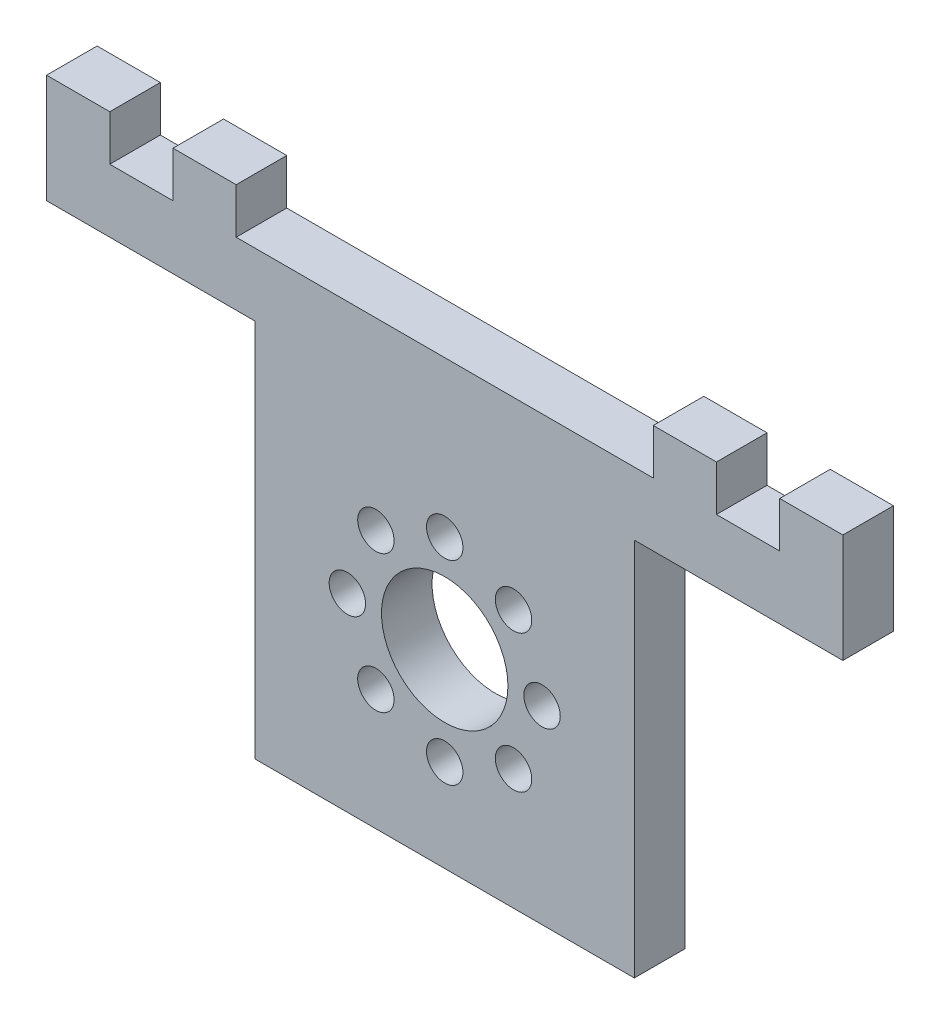
ISO-10303-21;
HEADER;
FILE_DESCRIPTION(('STEP AP214'),'2;1');
FILE_NAME('part.step','',(''),(''),'','','');
FILE_SCHEMA(('AUTOMOTIVE_DESIGN { 1 0 10303 214 1 1 1 1 }'));
ENDSEC;
DATA;
#1=APPLICATION_CONTEXT('core data for automotive mechanical design processes');
#2=APPLICATION_PROTOCOL_DEFINITION('international standard','automotive_design',2000,#1);
#3=PRODUCT_CONTEXT('',#1,'mechanical');
#4=PRODUCT('Part','Part','',(#3));
#5=PRODUCT_RELATED_PRODUCT_CATEGORY('part','',(#4));
#6=PRODUCT_DEFINITION_FORMATION('','',#4);
#7=PRODUCT_DEFINITION_CONTEXT('part definition',#1,'design');
#8=PRODUCT_DEFINITION('design','',#6,#7);
#9=PRODUCT_DEFINITION_SHAPE('','',#8);
#10=(LENGTH_UNIT() NAMED_UNIT(*) SI_UNIT(.MILLI.,.METRE.));
#11=(NAMED_UNIT(*) PLANE_ANGLE_UNIT() SI_UNIT($,.RADIAN.));
#12=(NAMED_UNIT(*) SI_UNIT($,.STERADIAN.) SOLID_ANGLE_UNIT());
#13=UNCERTAINTY_MEASURE_WITH_UNIT(LENGTH_MEASURE(1.E-05),#10,'distance_accuracy_value','');
#14=(GEOMETRIC_REPRESENTATION_CONTEXT(3) GLOBAL_UNCERTAINTY_ASSIGNED_CONTEXT((#13)) GLOBAL_UNIT_ASSIGNED_CONTEXT((#10,
#11,#12)) REPRESENTATION_CONTEXT('',''));
#15=CARTESIAN_POINT('',(0.,0.,0.));
#16=DIRECTION('',(0.,0.,1.));
#17=DIRECTION('',(1.,0.,0.));
#18=AXIS2_PLACEMENT_3D('',#15,#16,#17);
#19=CARTESIAN_POINT('',(57.08030875,7.59023437500003,5.08));
#20=DIRECTION('',(0.,-1.,0.));
#21=DIRECTION('',(1.,0.,0.));
#22=AXIS2_PLACEMENT_3D('',#19,#20,#21);
#23=PLANE('',#22);
#24=DIRECTION('',(-1.,0.,0.));
#25=VECTOR('',#24,1.);
#26=CARTESIAN_POINT('',(57.08030875,7.59023437500003,5.08));
#27=LINE('',#26,#25);
#28=CARTESIAN_POINT('',(50.73030875,7.59023437500002,5.08));
#29=VERTEX_POINT('',#28);
#30=CARTESIAN_POINT('',(44.38030875,7.59023437500002,5.08));
#31=VERTEX_POINT('',#30);
#32=EDGE_CURVE('E48',#29,#31,#27,.T.);
#33=ORIENTED_EDGE('',*,*,#32,.F.);
#34=DIRECTION('',(0.,0.,-1.));
#35=VECTOR('',#34,1.);
#36=CARTESIAN_POINT('',(50.73030875,7.59023437500002,5.08));
#37=LINE('',#36,#35);
#38=CARTESIAN_POINT('',(50.73030875,7.59023437500002,0.));
#39=VERTEX_POINT('',#38);
#40=EDGE_CURVE('E184',#29,#39,#37,.T.);
#41=ORIENTED_EDGE('',*,*,#40,.T.);
#42=DIRECTION('',(-1.,0.,0.));
#43=VECTOR('',#42,1.);
#44=CARTESIAN_POINT('',(57.08030875,7.59023437500003,0.));
#45=LINE('',#44,#43);
#46=CARTESIAN_POINT('',(44.38030875,7.59023437500002,0.));
#47=VERTEX_POINT('',#46);
#48=EDGE_CURVE('E300',#39,#47,#45,.T.);
#49=ORIENTED_EDGE('',*,*,#48,.T.);
#50=DIRECTION('',(0.,0.,-1.));
#51=VECTOR('',#50,1.);
#52=CARTESIAN_POINT('',(44.38030875,7.59023437500003,5.08));
#53=LINE('',#52,#51);
#54=EDGE_CURVE('E227',#31,#47,#53,.T.);
#55=ORIENTED_EDGE('',*,*,#54,.F.);
#56=EDGE_LOOP('',(#33,#41,#49,#55));
#57=FACE_BOUND('',#56,.T.);
#58=ADVANCED_FACE('F33',(#57),#23,.F.);
#59=CARTESIAN_POINT('',(-10.21953125,7.590234375,5.08));
#60=VERTEX_POINT('',#59);
#61=CARTESIAN_POINT('',(-16.56953125,7.590234375,5.08));
#62=VERTEX_POINT('',#61);
#63=EDGE_CURVE('E286',#60,#62,#27,.T.);
#64=ORIENTED_EDGE('',*,*,#63,.F.);
#65=DIRECTION('',(0.,0.,-1.));
#66=VECTOR('',#65,1.);
#67=CARTESIAN_POINT('',(-10.21953125,7.59023437500003,5.08));
#68=LINE('',#67,#66);
#69=CARTESIAN_POINT('',(-10.21953125,7.59023437500003,0.));
#70=VERTEX_POINT('',#69);
#71=EDGE_CURVE('E254',#60,#70,#68,.T.);
#72=ORIENTED_EDGE('',*,*,#71,.T.);
#73=CARTESIAN_POINT('',(-16.56953125,7.59023437500002,0.));
#74=VERTEX_POINT('',#73);
#75=EDGE_CURVE('E279',#70,#74,#45,.T.);
#76=ORIENTED_EDGE('',*,*,#75,.T.);
#77=DIRECTION('',(0.,0.,-1.));
#78=VECTOR('',#77,1.);
#79=CARTESIAN_POINT('',(-16.56953125,7.59023437500002,5.08));
#80=LINE('',#79,#78);
#81=EDGE_CURVE('E276',#62,#74,#80,.T.);
#82=ORIENTED_EDGE('',*,*,#81,.F.);
#83=EDGE_LOOP('',(#64,#72,#76,#82));
#84=FACE_BOUND('',#83,.T.);
#85=ADVANCED_FACE('F367',(#84),#23,.F.);
#86=CARTESIAN_POINT('',(38.03030875,7.59023437500002,5.08));
#87=VERTEX_POINT('',#86);
#88=CARTESIAN_POINT('',(-3.86953125,7.59023437500001,5.08));
#89=VERTEX_POINT('',#88);
#90=EDGE_CURVE('E56',#87,#89,#27,.T.);
#91=ORIENTED_EDGE('',*,*,#90,.F.);
#92=DIRECTION('',(0.,0.,-1.));
#93=VECTOR('',#92,1.);
#94=CARTESIAN_POINT('',(38.03030875,7.59023437500002,5.08));
#95=LINE('',#94,#93);
#96=CARTESIAN_POINT('',(38.03030875,7.59023437500002,0.));
#97=VERTEX_POINT('',#96);
#98=EDGE_CURVE('E219',#87,#97,#95,.T.);
#99=ORIENTED_EDGE('',*,*,#98,.T.);
#100=CARTESIAN_POINT('',(-3.86953125,7.59023437500001,0.));
#101=VERTEX_POINT('',#100);
#102=EDGE_CURVE('E303',#97,#101,#45,.T.);
#103=ORIENTED_EDGE('',*,*,#102,.T.);
#104=DIRECTION('',(0.,0.,-1.));
#105=VECTOR('',#104,1.);
#106=CARTESIAN_POINT('',(-3.86953125,7.59023437500002,5.08));
#107=LINE('',#106,#105);
#108=EDGE_CURVE('E258',#89,#101,#107,.T.);
#109=ORIENTED_EDGE('',*,*,#108,.F.);
#110=EDGE_LOOP('',(#91,#99,#103,#109));
#111=FACE_BOUND('',#110,.T.);
#112=ADVANCED_FACE('F35',(#111),#23,.F.);
#113=CARTESIAN_POINT('',(-22.91953125,7.590234375,5.08));
#114=DIRECTION('',(1.,0.,0.));
#115=DIRECTION('',(0.,0.,-1.));
#116=AXIS2_PLACEMENT_3D('',#113,#114,#115);
#117=PLANE('',#116);
#118=DIRECTION('',(0.,-1.,0.));
#119=VECTOR('',#118,1.);
#120=CARTESIAN_POINT('',(-22.91953125,7.590234375,0.));
#121=LINE('',#120,#119);
#122=CARTESIAN_POINT('',(-22.91953125,12.162234375,0.));
#123=VERTEX_POINT('',#122);
#124=CARTESIAN_POINT('',(-22.91953125,1.240234375,0.));
#125=VERTEX_POINT('',#124);
#126=EDGE_CURVE('E302',#123,#125,#121,.T.);
#127=ORIENTED_EDGE('',*,*,#126,.T.);
#128=DIRECTION('',(0.,0.,-1.));
#129=VECTOR('',#128,1.);
#130=CARTESIAN_POINT('',(-22.91953125,1.240234375,5.08));
#131=LINE('',#130,#129);
#132=CARTESIAN_POINT('',(-22.91953125,1.240234375,5.08));
#133=VERTEX_POINT('',#132);
#134=EDGE_CURVE('E11',#133,#125,#131,.T.);
#135=ORIENTED_EDGE('',*,*,#134,.F.);
#136=DIRECTION('',(0.,-1.,0.));
#137=VECTOR('',#136,1.);
#138=CARTESIAN_POINT('',(-22.91953125,7.590234375,5.08));
#139=LINE('',#138,#137);
#140=CARTESIAN_POINT('',(-22.91953125,12.162234375,5.08));
#141=VERTEX_POINT('',#140);
#142=EDGE_CURVE('E285',#141,#133,#139,.T.);
#143=ORIENTED_EDGE('',*,*,#142,.F.);
#144=DIRECTION('',(0.,0.,-1.));
#145=VECTOR('',#144,1.);
#146=CARTESIAN_POINT('',(-22.91953125,12.162234375,5.08));
#147=LINE('',#146,#145);
#148=EDGE_CURVE('E271',#141,#123,#147,.T.);
#149=ORIENTED_EDGE('',*,*,#148,.T.);
#150=EDGE_LOOP('',(#127,#135,#143,#149));
#151=FACE_BOUND('',#150,.T.);
#152=ADVANCED_FACE('F356',(#151),#117,.F.);
#153=CARTESIAN_POINT('',(-22.91953125,1.240234375,5.08));
#154=DIRECTION('',(0.,1.,0.));
#155=DIRECTION('',(-1.,0.,0.));
#156=AXIS2_PLACEMENT_3D('',#153,#154,#155);
#157=PLANE('',#156);
#158=DIRECTION('',(1.,0.,0.));
#159=VECTOR('',#158,1.);
#160=CARTESIAN_POINT('',(-22.91953125,1.240234375,0.));
#161=LINE('',#160,#159);
#162=CARTESIAN_POINT('',(-1.96961125,1.240234375,0.));
#163=VERTEX_POINT('',#162);
#164=EDGE_CURVE('E305',#125,#163,#161,.T.);
#165=ORIENTED_EDGE('',*,*,#164,.T.);
#166=DIRECTION('',(0.,0.,-1.));
#167=VECTOR('',#166,1.);
#168=CARTESIAN_POINT('',(-1.96961125,1.240234375,5.08));
#169=LINE('',#168,#167);
#170=CARTESIAN_POINT('',(-1.96961125,1.240234375,5.08));
#171=VERTEX_POINT('',#170);
#172=EDGE_CURVE('E41',#171,#163,#169,.T.);
#173=ORIENTED_EDGE('',*,*,#172,.F.);
#174=DIRECTION('',(1.,0.,0.));
#175=VECTOR('',#174,1.);
#176=CARTESIAN_POINT('',(-22.91953125,1.240234375,5.08));
#177=LINE('',#176,#175);
#178=EDGE_CURVE('E288',#133,#171,#177,.T.);
#179=ORIENTED_EDGE('',*,*,#178,.F.);
#180=ORIENTED_EDGE('',*,*,#134,.T.);
#181=EDGE_LOOP('',(#165,#173,#179,#180));
#182=FACE_BOUND('',#181,.T.);
#183=ADVANCED_FACE('F354',(#182),#157,.F.);
#184=CARTESIAN_POINT('',(-1.96961125,1.240234375,5.08));
#185=DIRECTION('',(1.,0.,0.));
#186=DIRECTION('',(0.,1.,0.));
#187=AXIS2_PLACEMENT_3D('',#184,#185,#186);
#188=PLANE('',#187);
#189=DIRECTION('',(0.,-1.,0.));
#190=VECTOR('',#189,1.);
#191=CARTESIAN_POINT('',(-1.96961125,1.240234375,0.));
#192=LINE('',#191,#190);
#193=CARTESIAN_POINT('',(-1.96961125,-36.859765625,0.));
#194=VERTEX_POINT('',#193);
#195=EDGE_CURVE('E307',#163,#194,#192,.T.);
#196=ORIENTED_EDGE('',*,*,#195,.T.);
#197=DIRECTION('',(0.,0.,-1.));
#198=VECTOR('',#197,1.);
#199=CARTESIAN_POINT('',(-1.96961125,-36.859765625,5.08));
#200=LINE('',#199,#198);
#201=CARTESIAN_POINT('',(-1.96961125,-36.859765625,5.08));
#202=VERTEX_POINT('',#201);
#203=EDGE_CURVE('E325',#202,#194,#200,.T.);
#204=ORIENTED_EDGE('',*,*,#203,.F.);
#205=DIRECTION('',(0.,-1.,0.));
#206=VECTOR('',#205,1.);
#207=CARTESIAN_POINT('',(-1.96961125,1.240234375,5.08));
#208=LINE('',#207,#206);
#209=EDGE_CURVE('E290',#171,#202,#208,.T.);
#210=ORIENTED_EDGE('',*,*,#209,.F.);
#211=ORIENTED_EDGE('',*,*,#172,.T.);
#212=EDGE_LOOP('',(#196,#204,#210,#211));
#213=FACE_BOUND('',#212,.T.);
#214=ADVANCED_FACE('F332',(#213),#188,.F.);
#215=CARTESIAN_POINT('',(-1.96961125,-36.859765625,5.08));
#216=DIRECTION('',(0.,1.,0.));
#217=DIRECTION('',(-1.,0.,0.));
#218=AXIS2_PLACEMENT_3D('',#215,#216,#217);
#219=PLANE('',#218);
#220=DIRECTION('',(1.,0.,0.));
#221=VECTOR('',#220,1.);
#222=CARTESIAN_POINT('',(-1.96961125,-36.859765625,0.));
#223=LINE('',#222,#221);
#224=CARTESIAN_POINT('',(36.13038875,-36.859765625,0.));
#225=VERTEX_POINT('',#224);
#226=EDGE_CURVE('E309',#194,#225,#223,.T.);
#227=ORIENTED_EDGE('',*,*,#226,.T.);
#228=DIRECTION('',(0.,0.,-1.));
#229=VECTOR('',#228,1.);
#230=CARTESIAN_POINT('',(36.13038875,-36.859765625,5.08));
#231=LINE('',#230,#229);
#232=CARTESIAN_POINT('',(36.13038875,-36.859765625,5.08));
#233=VERTEX_POINT('',#232);
#234=EDGE_CURVE('E322',#233,#225,#231,.T.);
#235=ORIENTED_EDGE('',*,*,#234,.F.);
#236=DIRECTION('',(1.,0.,0.));
#237=VECTOR('',#236,1.);
#238=CARTESIAN_POINT('',(-1.96961125,-36.859765625,5.08));
#239=LINE('',#238,#237);
#240=EDGE_CURVE('E292',#202,#233,#239,.T.);
#241=ORIENTED_EDGE('',*,*,#240,.F.);
#242=ORIENTED_EDGE('',*,*,#203,.T.);
#243=EDGE_LOOP('',(#227,#235,#241,#242));
#244=FACE_BOUND('',#243,.T.);
#245=ADVANCED_FACE('F344',(#244),#219,.F.);
#246=CARTESIAN_POINT('',(36.13038875,-36.859765625,5.08));
#247=DIRECTION('',(-1.,0.,0.));
#248=DIRECTION('',(0.,0.,1.));
#249=AXIS2_PLACEMENT_3D('',#246,#247,#248);
#250=PLANE('',#249);
#251=DIRECTION('',(0.,1.,0.));
#252=VECTOR('',#251,1.);
#253=CARTESIAN_POINT('',(36.13038875,-36.859765625,0.));
#254=LINE('',#253,#252);
#255=CARTESIAN_POINT('',(36.13038875,1.24023437500002,0.));
#256=VERTEX_POINT('',#255);
#257=EDGE_CURVE('E311',#225,#256,#254,.T.);
#258=ORIENTED_EDGE('',*,*,#257,.T.);
#259=DIRECTION('',(0.,0.,-1.));
#260=VECTOR('',#259,1.);
#261=CARTESIAN_POINT('',(36.13038875,1.24023437500002,5.08));
#262=LINE('',#261,#260);
#263=CARTESIAN_POINT('',(36.13038875,1.24023437500002,5.08));
#264=VERTEX_POINT('',#263);
#265=EDGE_CURVE('E319',#264,#256,#262,.T.);
#266=ORIENTED_EDGE('',*,*,#265,.F.);
#267=DIRECTION('',(0.,1.,0.));
#268=VECTOR('',#267,1.);
#269=CARTESIAN_POINT('',(36.13038875,-36.859765625,5.08));
#270=LINE('',#269,#268);
#271=EDGE_CURVE('E294',#233,#264,#270,.T.);
#272=ORIENTED_EDGE('',*,*,#271,.F.);
#273=ORIENTED_EDGE('',*,*,#234,.T.);
#274=EDGE_LOOP('',(#258,#266,#272,#273));
#275=FACE_BOUND('',#274,.T.);
#276=ADVANCED_FACE('F348',(#275),#250,.F.);
#277=CARTESIAN_POINT('',(36.13038875,1.24023437500002,5.08));
#278=DIRECTION('',(0.,1.,0.));
#279=DIRECTION('',(-1.,0.,0.));
#280=AXIS2_PLACEMENT_3D('',#277,#278,#279);
#281=PLANE('',#280);
#282=DIRECTION('',(1.,0.,0.));
#283=VECTOR('',#282,1.);
#284=CARTESIAN_POINT('',(36.13038875,1.24023437500002,0.));
#285=LINE('',#284,#283);
#286=CARTESIAN_POINT('',(57.08030875,1.24023437500003,0.));
#287=VERTEX_POINT('',#286);
#288=EDGE_CURVE('E313',#256,#287,#285,.T.);
#289=ORIENTED_EDGE('',*,*,#288,.T.);
#290=DIRECTION('',(0.,0.,-1.));
#291=VECTOR('',#290,1.);
#292=CARTESIAN_POINT('',(57.08030875,1.24023437500003,5.08));
#293=LINE('',#292,#291);
#294=CARTESIAN_POINT('',(57.08030875,1.24023437500003,5.08));
#295=VERTEX_POINT('',#294);
#296=EDGE_CURVE('E299',#295,#287,#293,.T.);
#297=ORIENTED_EDGE('',*,*,#296,.F.);
#298=DIRECTION('',(1.,0.,0.));
#299=VECTOR('',#298,1.);
#300=CARTESIAN_POINT('',(36.13038875,1.24023437500002,5.08));
#301=LINE('',#300,#299);
#302=EDGE_CURVE('E296',#264,#295,#301,.T.);
#303=ORIENTED_EDGE('',*,*,#302,.F.);
#304=ORIENTED_EDGE('',*,*,#265,.T.);
#305=EDGE_LOOP('',(#289,#297,#303,#304));
#306=FACE_BOUND('',#305,.T.);
#307=ADVANCED_FACE('F412',(#306),#281,.F.);
#308=CARTESIAN_POINT('',(57.08030875,1.24023437500003,5.08));
#309=DIRECTION('',(-1.,0.,0.));
#310=DIRECTION('',(0.,0.,1.));
#311=AXIS2_PLACEMENT_3D('',#308,#309,#310);
#312=PLANE('',#311);
#313=DIRECTION('',(0.,1.,0.));
#314=VECTOR('',#313,1.);
#315=CARTESIAN_POINT('',(57.08030875,1.24023437500003,0.));
#316=LINE('',#315,#314);
#317=CARTESIAN_POINT('',(57.08030875,12.162234375,0.));
#318=VERTEX_POINT('',#317);
#319=EDGE_CURVE('E315',#287,#318,#316,.T.);
#320=ORIENTED_EDGE('',*,*,#319,.T.);
#321=DIRECTION('',(0.,0.,-1.));
#322=VECTOR('',#321,1.);
#323=CARTESIAN_POINT('',(57.08030875,12.162234375,5.08));
#324=LINE('',#323,#322);
#325=CARTESIAN_POINT('',(57.08030875,12.162234375,5.08));
#326=VERTEX_POINT('',#325);
#327=EDGE_CURVE('E183',#326,#318,#324,.T.);
#328=ORIENTED_EDGE('',*,*,#327,.F.);
#329=DIRECTION('',(0.,1.,0.));
#330=VECTOR('',#329,1.);
#331=CARTESIAN_POINT('',(57.08030875,1.24023437500003,5.08));
#332=LINE('',#331,#330);
#333=EDGE_CURVE('E193',#295,#326,#332,.T.);
#334=ORIENTED_EDGE('',*,*,#333,.F.);
#335=ORIENTED_EDGE('',*,*,#296,.T.);
#336=EDGE_LOOP('',(#320,#328,#334,#335));
#337=FACE_BOUND('',#336,.T.);
#338=ADVANCED_FACE('F415',(#337),#312,.F.);
#339=CARTESIAN_POINT('',(0.,0.,5.08));
#340=DIRECTION('',(0.,0.,1.));
#341=DIRECTION('',(1.,0.,0.));
#342=AXIS2_PLACEMENT_3D('',#339,#340,#341);
#343=PLANE('',#342);
#344=DIRECTION('',(0.,1.,0.));
#345=VECTOR('',#344,1.);
#346=CARTESIAN_POINT('',(38.03030875,7.59023437500002,5.08));
#347=LINE('',#346,#345);
#348=CARTESIAN_POINT('',(38.03030875,12.162234375,5.08));
#349=VERTEX_POINT('',#348);
#350=EDGE_CURVE('E209',#87,#349,#347,.T.);
#351=ORIENTED_EDGE('',*,*,#350,.F.);
#352=ORIENTED_EDGE('',*,*,#90,.T.);
#353=DIRECTION('',(0.,-1.,0.));
#354=VECTOR('',#353,1.);
#355=CARTESIAN_POINT('',(-3.86953125,7.59023437500002,5.08));
#356=LINE('',#355,#354);
#357=CARTESIAN_POINT('',(-3.86953125,12.162234375,5.08));
#358=VERTEX_POINT('',#357);
#359=EDGE_CURVE('E243',#358,#89,#356,.T.);
#360=ORIENTED_EDGE('',*,*,#359,.F.);
#361=DIRECTION('',(1.,0.,0.));
#362=VECTOR('',#361,1.);
#363=CARTESIAN_POINT('',(-10.21953125,12.162234375,5.08));
#364=LINE('',#363,#362);
#365=CARTESIAN_POINT('',(-10.21953125,12.162234375,5.08));
#366=VERTEX_POINT('',#365);
#367=EDGE_CURVE('E239',#366,#358,#364,.T.);
#368=ORIENTED_EDGE('',*,*,#367,.F.);
#369=DIRECTION('',(0.,1.,0.));
#370=VECTOR('',#369,1.);
#371=CARTESIAN_POINT('',(-10.21953125,7.59023437500003,5.08));
#372=LINE('',#371,#370);
#373=EDGE_CURVE('E236',#60,#366,#372,.T.);
#374=ORIENTED_EDGE('',*,*,#373,.F.);
#375=ORIENTED_EDGE('',*,*,#63,.T.);
#376=DIRECTION('',(0.,-1.,0.));
#377=VECTOR('',#376,1.);
#378=CARTESIAN_POINT('',(-16.56953125,7.59023437500002,5.08));
#379=LINE('',#378,#377);
#380=CARTESIAN_POINT('',(-16.56953125,12.162234375,5.08));
#381=VERTEX_POINT('',#380);
#382=EDGE_CURVE('E267',#381,#62,#379,.T.);
#383=ORIENTED_EDGE('',*,*,#382,.F.);
#384=DIRECTION('',(1.,0.,0.));
#385=VECTOR('',#384,1.);
#386=CARTESIAN_POINT('',(-22.91953125,12.162234375,5.08));
#387=LINE('',#386,#385);
#388=EDGE_CURVE('E264',#141,#381,#387,.T.);
#389=ORIENTED_EDGE('',*,*,#388,.F.);
#390=ORIENTED_EDGE('',*,*,#142,.T.);
#391=ORIENTED_EDGE('',*,*,#178,.T.);
#392=ORIENTED_EDGE('',*,*,#209,.T.);
#393=ORIENTED_EDGE('',*,*,#240,.T.);
#394=ORIENTED_EDGE('',*,*,#271,.T.);
#395=ORIENTED_EDGE('',*,*,#302,.T.);
#396=ORIENTED_EDGE('',*,*,#333,.T.);
#397=DIRECTION('',(1.,0.,0.));
#398=VECTOR('',#397,1.);
#399=CARTESIAN_POINT('',(57.08030875,12.162234375,5.08));
#400=LINE('',#399,#398);
#401=CARTESIAN_POINT('',(50.73030875,12.162234375,5.08));
#402=VERTEX_POINT('',#401);
#403=EDGE_CURVE('E176',#402,#326,#400,.T.);
#404=ORIENTED_EDGE('',*,*,#403,.F.);
#405=DIRECTION('',(0.,1.,0.));
#406=VECTOR('',#405,1.);
#407=CARTESIAN_POINT('',(50.73030875,7.59023437500002,5.08));
#408=LINE('',#407,#406);
#409=EDGE_CURVE('E191',#29,#402,#408,.T.);
#410=ORIENTED_EDGE('',*,*,#409,.F.);
#411=ORIENTED_EDGE('',*,*,#32,.T.);
#412=DIRECTION('',(0.,-1.,0.));
#413=VECTOR('',#412,1.);
#414=CARTESIAN_POINT('',(44.38030875,7.59023437500003,5.08));
#415=LINE('',#414,#413);
#416=CARTESIAN_POINT('',(44.38030875,12.162234375,5.08));
#417=VERTEX_POINT('',#416);
#418=EDGE_CURVE('E216',#417,#31,#415,.T.);
#419=ORIENTED_EDGE('',*,*,#418,.F.);
#420=DIRECTION('',(1.,0.,0.));
#421=VECTOR('',#420,1.);
#422=CARTESIAN_POINT('',(44.38030875,12.162234375,5.08));
#423=LINE('',#422,#421);
#424=EDGE_CURVE('E212',#349,#417,#423,.T.);
#425=ORIENTED_EDGE('',*,*,#424,.F.);
#426=EDGE_LOOP('',(#351,#352,#360,#368,#374,#375,#383,#389,#390,#391,#392,#393,#394,#395,#396,
#404,#410,#411,#419,#425));
#427=FACE_BOUND('',#426,.T.);
#428=CARTESIAN_POINT('',(10.1655915367767,-24.7245628382232,5.08));
#429=DIRECTION('',(0.,0.,1.));
#430=DIRECTION('',(1.,0.,0.));
#431=AXIS2_PLACEMENT_3D('',#428,#429,#430);
#432=CIRCLE('',#431,1.8288);
#433=CARTESIAN_POINT('',(11.9943915367767,-24.7245628382232,5.08));
#434=VERTEX_POINT('',#433);
#435=EDGE_CURVE('E707',#434,#434,#432,.T.);
#436=ORIENTED_EDGE('',*,*,#435,.F.);
#437=EDGE_LOOP('',(#436));
#438=FACE_BOUND('',#437,.T.);
#439=CARTESIAN_POINT('',(17.0803887499999,-27.588765625,5.08));
#440=DIRECTION('',(0.,0.,1.));
#441=DIRECTION('',(1.,0.,0.));
#442=AXIS2_PLACEMENT_3D('',#439,#440,#441);
#443=CIRCLE('',#442,1.8288);
#444=CARTESIAN_POINT('',(18.9091887499999,-27.588765625,5.08));
#445=VERTEX_POINT('',#444);
#446=EDGE_CURVE('E709',#445,#445,#443,.T.);
#447=ORIENTED_EDGE('',*,*,#446,.F.);
#448=EDGE_LOOP('',(#447));
#449=FACE_BOUND('',#448,.T.);
#450=CARTESIAN_POINT('',(23.9951859632232,-24.7245628382233,5.08));
#451=DIRECTION('',(0.,0.,1.));
#452=DIRECTION('',(1.,0.,0.));
#453=AXIS2_PLACEMENT_3D('',#450,#451,#452);
#454=CIRCLE('',#453,1.8288);
#455=CARTESIAN_POINT('',(25.8239859632232,-24.7245628382233,5.08));
#456=VERTEX_POINT('',#455);
#457=EDGE_CURVE('E757',#456,#456,#454,.T.);
#458=ORIENTED_EDGE('',*,*,#457,.F.);
#459=EDGE_LOOP('',(#458));
#460=FACE_BOUND('',#459,.T.);
#461=CARTESIAN_POINT('',(26.85938875,-17.8097656250001,5.08));
#462=DIRECTION('',(0.,0.,1.));
#463=DIRECTION('',(1.,0.,0.));
#464=AXIS2_PLACEMENT_3D('',#461,#462,#463);
#465=CIRCLE('',#464,1.8288);
#466=CARTESIAN_POINT('',(28.68818875,-17.8097656250001,5.08));
#467=VERTEX_POINT('',#466);
#468=EDGE_CURVE('E747',#467,#467,#465,.T.);
#469=ORIENTED_EDGE('',*,*,#468,.F.);
#470=EDGE_LOOP('',(#469));
#471=FACE_BOUND('',#470,.T.);
#472=CARTESIAN_POINT('',(23.9951859632233,-10.8949684117768,5.08));
#473=DIRECTION('',(0.,0.,1.));
#474=DIRECTION('',(1.,0.,0.));
#475=AXIS2_PLACEMENT_3D('',#472,#473,#474);
#476=CIRCLE('',#475,1.8288);
#477=CARTESIAN_POINT('',(25.8239859632233,-10.8949684117768,5.08));
#478=VERTEX_POINT('',#477);
#479=EDGE_CURVE('E734',#478,#478,#476,.T.);
#480=ORIENTED_EDGE('',*,*,#479,.F.);
#481=EDGE_LOOP('',(#480));
#482=FACE_BOUND('',#481,.T.);
#483=CARTESIAN_POINT('',(17.08038875,-8.03076562499999,5.08));
#484=DIRECTION('',(0.,0.,1.));
#485=DIRECTION('',(1.,0.,0.));
#486=AXIS2_PLACEMENT_3D('',#483,#484,#485);
#487=CIRCLE('',#486,1.8288);
#488=CARTESIAN_POINT('',(18.90918875,-8.03076562499999,5.08));
#489=VERTEX_POINT('',#488);
#490=EDGE_CURVE('E728',#489,#489,#487,.T.);
#491=ORIENTED_EDGE('',*,*,#490,.F.);
#492=EDGE_LOOP('',(#491));
#493=FACE_BOUND('',#492,.T.);
#494=CARTESIAN_POINT('',(10.1655915367768,-10.8949684117767,5.08));
#495=DIRECTION('',(0.,0.,1.));
#496=DIRECTION('',(1.,0.,0.));
#497=AXIS2_PLACEMENT_3D('',#494,#495,#496);
#498=CIRCLE('',#497,1.8288);
#499=CARTESIAN_POINT('',(11.9943915367768,-10.8949684117767,5.08));
#500=VERTEX_POINT('',#499);
#501=EDGE_CURVE('E722',#500,#500,#498,.T.);
#502=ORIENTED_EDGE('',*,*,#501,.F.);
#503=EDGE_LOOP('',(#502));
#504=FACE_BOUND('',#503,.T.);
#505=CARTESIAN_POINT('',(7.30138875,-17.809765625,5.08));
#506=DIRECTION('',(0.,0.,1.));
#507=DIRECTION('',(1.,0.,0.));
#508=AXIS2_PLACEMENT_3D('',#505,#506,#507);
#509=CIRCLE('',#508,1.8288);
#510=CARTESIAN_POINT('',(9.13018875,-17.809765625,5.08));
#511=VERTEX_POINT('',#510);
#512=EDGE_CURVE('E716',#511,#511,#509,.T.);
#513=ORIENTED_EDGE('',*,*,#512,.F.);
#514=EDGE_LOOP('',(#513));
#515=FACE_BOUND('',#514,.T.);
#516=CARTESIAN_POINT('',(17.08038875,-17.809765625,5.08));
#517=DIRECTION('',(0.,0.,1.));
#518=DIRECTION('',(1.,0.,0.));
#519=AXIS2_PLACEMENT_3D('',#516,#517,#518);
#520=CIRCLE('',#519,6.35);
#521=CARTESIAN_POINT('',(23.43038875,-17.809765625,5.08));
#522=VERTEX_POINT('',#521);
#523=EDGE_CURVE('E201',#522,#522,#520,.T.);
#524=ORIENTED_EDGE('',*,*,#523,.F.);
#525=EDGE_LOOP('',(#524));
#526=FACE_BOUND('',#525,.T.);
#527=ADVANCED_FACE('F189',(#427,#438,#449,#460,#471,#482,#493,#504,#515,#526),#343,.T.);
#528=CARTESIAN_POINT('',(0.,0.,0.));
#529=DIRECTION('',(0.,0.,1.));
#530=DIRECTION('',(1.,0.,0.));
#531=AXIS2_PLACEMENT_3D('',#528,#529,#530);
#532=PLANE('',#531);
#533=CARTESIAN_POINT('',(10.1655915367767,-24.7245628382232,0.));
#534=DIRECTION('',(0.,0.,1.));
#535=DIRECTION('',(1.,0.,0.));
#536=AXIS2_PLACEMENT_3D('',#533,#534,#535);
#537=CIRCLE('',#536,1.8288);
#538=CARTESIAN_POINT('',(11.9943915367767,-24.7245628382232,0.));
#539=VERTEX_POINT('',#538);
#540=EDGE_CURVE('E704',#539,#539,#537,.T.);
#541=ORIENTED_EDGE('',*,*,#540,.T.);
#542=EDGE_LOOP('',(#541));
#543=FACE_BOUND('',#542,.T.);
#544=CARTESIAN_POINT('',(17.0803887499999,-27.588765625,0.));
#545=DIRECTION('',(0.,0.,1.));
#546=DIRECTION('',(1.,0.,0.));
#547=AXIS2_PLACEMENT_3D('',#544,#545,#546);
#548=CIRCLE('',#547,1.8288);
#549=CARTESIAN_POINT('',(18.9091887499999,-27.588765625,0.));
#550=VERTEX_POINT('',#549);
#551=EDGE_CURVE('E760',#550,#550,#548,.T.);
#552=ORIENTED_EDGE('',*,*,#551,.T.);
#553=EDGE_LOOP('',(#552));
#554=FACE_BOUND('',#553,.T.);
#555=CARTESIAN_POINT('',(23.9951859632232,-24.7245628382233,0.));
#556=DIRECTION('',(0.,0.,1.));
#557=DIRECTION('',(1.,0.,0.));
#558=AXIS2_PLACEMENT_3D('',#555,#556,#557);
#559=CIRCLE('',#558,1.8288);
#560=CARTESIAN_POINT('',(25.8239859632232,-24.7245628382233,0.));
#561=VERTEX_POINT('',#560);
#562=EDGE_CURVE('E752',#561,#561,#559,.T.);
#563=ORIENTED_EDGE('',*,*,#562,.T.);
#564=EDGE_LOOP('',(#563));
#565=FACE_BOUND('',#564,.T.);
#566=CARTESIAN_POINT('',(26.85938875,-17.8097656250001,0.));
#567=DIRECTION('',(0.,0.,1.));
#568=DIRECTION('',(1.,0.,0.));
#569=AXIS2_PLACEMENT_3D('',#566,#567,#568);
#570=CIRCLE('',#569,1.8288);
#571=CARTESIAN_POINT('',(28.68818875,-17.8097656250001,0.));
#572=VERTEX_POINT('',#571);
#573=EDGE_CURVE('E736',#572,#572,#570,.T.);
#574=ORIENTED_EDGE('',*,*,#573,.T.);
#575=EDGE_LOOP('',(#574));
#576=FACE_BOUND('',#575,.T.);
#577=CARTESIAN_POINT('',(23.9951859632233,-10.8949684117768,0.));
#578=DIRECTION('',(0.,0.,1.));
#579=DIRECTION('',(1.,0.,0.));
#580=AXIS2_PLACEMENT_3D('',#577,#578,#579);
#581=CIRCLE('',#580,1.8288);
#582=CARTESIAN_POINT('',(25.8239859632233,-10.8949684117768,0.));
#583=VERTEX_POINT('',#582);
#584=EDGE_CURVE('E731',#583,#583,#581,.T.);
#585=ORIENTED_EDGE('',*,*,#584,.T.);
#586=EDGE_LOOP('',(#585));
#587=FACE_BOUND('',#586,.T.);
#588=CARTESIAN_POINT('',(17.08038875,-8.03076562499999,0.));
#589=DIRECTION('',(0.,0.,1.));
#590=DIRECTION('',(1.,0.,0.));
#591=AXIS2_PLACEMENT_3D('',#588,#589,#590);
#592=CIRCLE('',#591,1.8288);
#593=CARTESIAN_POINT('',(18.90918875,-8.03076562499999,0.));
#594=VERTEX_POINT('',#593);
#595=EDGE_CURVE('E725',#594,#594,#592,.T.);
#596=ORIENTED_EDGE('',*,*,#595,.T.);
#597=EDGE_LOOP('',(#596));
#598=FACE_BOUND('',#597,.T.);
#599=CARTESIAN_POINT('',(10.1655915367768,-10.8949684117767,0.));
#600=DIRECTION('',(0.,0.,1.));
#601=DIRECTION('',(1.,0.,0.));
#602=AXIS2_PLACEMENT_3D('',#599,#600,#601);
#603=CIRCLE('',#602,1.8288);
#604=CARTESIAN_POINT('',(11.9943915367768,-10.8949684117767,0.));
#605=VERTEX_POINT('',#604);
#606=EDGE_CURVE('E719',#605,#605,#603,.T.);
#607=ORIENTED_EDGE('',*,*,#606,.T.);
#608=EDGE_LOOP('',(#607));
#609=FACE_BOUND('',#608,.T.);
#610=CARTESIAN_POINT('',(7.30138875,-17.809765625,0.));
#611=DIRECTION('',(0.,0.,1.));
#612=DIRECTION('',(1.,0.,0.));
#613=AXIS2_PLACEMENT_3D('',#610,#611,#612);
#614=CIRCLE('',#613,1.8288);
#615=CARTESIAN_POINT('',(9.13018875,-17.809765625,0.));
#616=VERTEX_POINT('',#615);
#617=EDGE_CURVE('E713',#616,#616,#614,.T.);
#618=ORIENTED_EDGE('',*,*,#617,.T.);
#619=EDGE_LOOP('',(#618));
#620=FACE_BOUND('',#619,.T.);
#621=CARTESIAN_POINT('',(17.08038875,-17.809765625,0.));
#622=DIRECTION('',(0.,0.,1.));
#623=DIRECTION('',(1.,0.,0.));
#624=AXIS2_PLACEMENT_3D('',#621,#622,#623);
#625=CIRCLE('',#624,6.35);
#626=CARTESIAN_POINT('',(23.43038875,-17.809765625,0.));
#627=VERTEX_POINT('',#626);
#628=EDGE_CURVE('E204',#627,#627,#625,.T.);
#629=ORIENTED_EDGE('',*,*,#628,.T.);
#630=EDGE_LOOP('',(#629));
#631=FACE_BOUND('',#630,.T.);
#632=ORIENTED_EDGE('',*,*,#102,.F.);
#633=DIRECTION('',(0.,1.,0.));
#634=VECTOR('',#633,1.);
#635=CARTESIAN_POINT('',(38.03030875,7.59023437500002,0.));
#636=LINE('',#635,#634);
#637=CARTESIAN_POINT('',(38.03030875,12.162234375,0.));
#638=VERTEX_POINT('',#637);
#639=EDGE_CURVE('E206',#97,#638,#636,.T.);
#640=ORIENTED_EDGE('',*,*,#639,.T.);
#641=DIRECTION('',(1.,0.,0.));
#642=VECTOR('',#641,1.);
#643=CARTESIAN_POINT('',(44.38030875,12.162234375,0.));
#644=LINE('',#643,#642);
#645=CARTESIAN_POINT('',(44.38030875,12.162234375,0.));
#646=VERTEX_POINT('',#645);
#647=EDGE_CURVE('E222',#638,#646,#644,.T.);
#648=ORIENTED_EDGE('',*,*,#647,.T.);
#649=DIRECTION('',(0.,-1.,0.));
#650=VECTOR('',#649,1.);
#651=CARTESIAN_POINT('',(44.38030875,7.59023437500003,0.));
#652=LINE('',#651,#650);
#653=EDGE_CURVE('E213',#646,#47,#652,.T.);
#654=ORIENTED_EDGE('',*,*,#653,.T.);
#655=ORIENTED_EDGE('',*,*,#48,.F.);
#656=DIRECTION('',(0.,1.,0.));
#657=VECTOR('',#656,1.);
#658=CARTESIAN_POINT('',(50.73030875,7.59023437500002,0.));
#659=LINE('',#658,#657);
#660=CARTESIAN_POINT('',(50.73030875,12.162234375,0.));
#661=VERTEX_POINT('',#660);
#662=EDGE_CURVE('E198',#39,#661,#659,.T.);
#663=ORIENTED_EDGE('',*,*,#662,.T.);
#664=DIRECTION('',(1.,0.,0.));
#665=VECTOR('',#664,1.);
#666=CARTESIAN_POINT('',(57.08030875,12.162234375,0.));
#667=LINE('',#666,#665);
#668=EDGE_CURVE('E178',#661,#318,#667,.T.);
#669=ORIENTED_EDGE('',*,*,#668,.T.);
#670=ORIENTED_EDGE('',*,*,#319,.F.);
#671=ORIENTED_EDGE('',*,*,#288,.F.);
#672=ORIENTED_EDGE('',*,*,#257,.F.);
#673=ORIENTED_EDGE('',*,*,#226,.F.);
#674=ORIENTED_EDGE('',*,*,#195,.F.);
#675=ORIENTED_EDGE('',*,*,#164,.F.);
#676=ORIENTED_EDGE('',*,*,#126,.F.);
#677=DIRECTION('',(1.,0.,0.));
#678=VECTOR('',#677,1.);
#679=CARTESIAN_POINT('',(-22.91953125,12.162234375,0.));
#680=LINE('',#679,#678);
#681=CARTESIAN_POINT('',(-16.56953125,12.162234375,0.));
#682=VERTEX_POINT('',#681);
#683=EDGE_CURVE('E257',#123,#682,#680,.T.);
#684=ORIENTED_EDGE('',*,*,#683,.T.);
#685=DIRECTION('',(0.,-1.,0.));
#686=VECTOR('',#685,1.);
#687=CARTESIAN_POINT('',(-16.56953125,7.59023437500002,0.));
#688=LINE('',#687,#686);
#689=EDGE_CURVE('E268',#682,#74,#688,.T.);
#690=ORIENTED_EDGE('',*,*,#689,.T.);
#691=ORIENTED_EDGE('',*,*,#75,.F.);
#692=DIRECTION('',(0.,1.,0.));
#693=VECTOR('',#692,1.);
#694=CARTESIAN_POINT('',(-10.21953125,7.59023437500003,0.));
#695=LINE('',#694,#693);
#696=CARTESIAN_POINT('',(-10.21953125,12.162234375,0.));
#697=VERTEX_POINT('',#696);
#698=EDGE_CURVE('E230',#70,#697,#695,.T.);
#699=ORIENTED_EDGE('',*,*,#698,.T.);
#700=DIRECTION('',(1.,0.,0.));
#701=VECTOR('',#700,1.);
#702=CARTESIAN_POINT('',(-10.21953125,12.162234375,0.));
#703=LINE('',#702,#701);
#704=CARTESIAN_POINT('',(-3.86953125,12.162234375,0.));
#705=VERTEX_POINT('',#704);
#706=EDGE_CURVE('E249',#697,#705,#703,.T.);
#707=ORIENTED_EDGE('',*,*,#706,.T.);
#708=DIRECTION('',(0.,-1.,0.));
#709=VECTOR('',#708,1.);
#710=CARTESIAN_POINT('',(-3.86953125,7.59023437500002,0.));
#711=LINE('',#710,#709);
#712=EDGE_CURVE('E240',#705,#101,#711,.T.);
#713=ORIENTED_EDGE('',*,*,#712,.T.);
#714=EDGE_LOOP('',(#632,#640,#648,#654,#655,#663,#669,#670,#671,#672,#673,#674,#675,#676,#684,
#690,#691,#699,#707,#713));
#715=FACE_BOUND('',#714,.T.);
#716=ADVANCED_FACE('F339',(#543,#554,#565,#576,#587,#598,#609,#620,#631,#715),#532,.F.);
#717=CARTESIAN_POINT('',(-16.56953125,7.59023437500002,5.08));
#718=DIRECTION('',(1.,0.,0.));
#719=DIRECTION('',(0.,0.,-1.));
#720=AXIS2_PLACEMENT_3D('',#717,#718,#719);
#721=PLANE('',#720);
#722=ORIENTED_EDGE('',*,*,#689,.F.);
#723=DIRECTION('',(0.,0.,-1.));
#724=VECTOR('',#723,1.);
#725=CARTESIAN_POINT('',(-16.56953125,12.162234375,5.08));
#726=LINE('',#725,#724);
#727=EDGE_CURVE('E280',#381,#682,#726,.T.);
#728=ORIENTED_EDGE('',*,*,#727,.F.);
#729=ORIENTED_EDGE('',*,*,#382,.T.);
#730=ORIENTED_EDGE('',*,*,#81,.T.);
#731=EDGE_LOOP('',(#722,#728,#729,#730));
#732=FACE_BOUND('',#731,.T.);
#733=ADVANCED_FACE('F364',(#732),#721,.T.);
#734=CARTESIAN_POINT('',(-22.91953125,12.162234375,5.08));
#735=DIRECTION('',(0.,1.,0.));
#736=DIRECTION('',(0.,0.,1.));
#737=AXIS2_PLACEMENT_3D('',#734,#735,#736);
#738=PLANE('',#737);
#739=ORIENTED_EDGE('',*,*,#683,.F.);
#740=ORIENTED_EDGE('',*,*,#148,.F.);
#741=ORIENTED_EDGE('',*,*,#388,.T.);
#742=ORIENTED_EDGE('',*,*,#727,.T.);
#743=EDGE_LOOP('',(#739,#740,#741,#742));
#744=FACE_BOUND('',#743,.T.);
#745=ADVANCED_FACE('F361',(#744),#738,.T.);
#746=CARTESIAN_POINT('',(-10.21953125,7.59023437500003,5.08));
#747=DIRECTION('',(-1.,0.,0.));
#748=DIRECTION('',(0.,-1.,0.));
#749=AXIS2_PLACEMENT_3D('',#746,#747,#748);
#750=PLANE('',#749);
#751=ORIENTED_EDGE('',*,*,#698,.F.);
#752=ORIENTED_EDGE('',*,*,#71,.F.);
#753=ORIENTED_EDGE('',*,*,#373,.T.);
#754=DIRECTION('',(0.,0.,-1.));
#755=VECTOR('',#754,1.);
#756=CARTESIAN_POINT('',(-10.21953125,12.162234375,5.08));
#757=LINE('',#756,#755);
#758=EDGE_CURVE('E246',#366,#697,#757,.T.);
#759=ORIENTED_EDGE('',*,*,#758,.T.);
#760=EDGE_LOOP('',(#751,#752,#753,#759));
#761=FACE_BOUND('',#760,.T.);
#762=ADVANCED_FACE('F382',(#761),#750,.T.);
#763=CARTESIAN_POINT('',(-3.86953125,7.59023437500002,5.08));
#764=DIRECTION('',(1.,0.,0.));
#765=DIRECTION('',(0.,0.,-1.));
#766=AXIS2_PLACEMENT_3D('',#763,#764,#765);
#767=PLANE('',#766);
#768=ORIENTED_EDGE('',*,*,#712,.F.);
#769=DIRECTION('',(0.,0.,-1.));
#770=VECTOR('',#769,1.);
#771=CARTESIAN_POINT('',(-3.86953125,12.162234375,5.08));
#772=LINE('',#771,#770);
#773=EDGE_CURVE('E261',#358,#705,#772,.T.);
#774=ORIENTED_EDGE('',*,*,#773,.F.);
#775=ORIENTED_EDGE('',*,*,#359,.T.);
#776=ORIENTED_EDGE('',*,*,#108,.T.);
#777=EDGE_LOOP('',(#768,#774,#775,#776));
#778=FACE_BOUND('',#777,.T.);
#779=ADVANCED_FACE('F373',(#778),#767,.T.);
#780=CARTESIAN_POINT('',(-10.21953125,12.162234375,5.08));
#781=DIRECTION('',(0.,1.,0.));
#782=DIRECTION('',(0.,0.,1.));
#783=AXIS2_PLACEMENT_3D('',#780,#781,#782);
#784=PLANE('',#783);
#785=ORIENTED_EDGE('',*,*,#706,.F.);
#786=ORIENTED_EDGE('',*,*,#758,.F.);
#787=ORIENTED_EDGE('',*,*,#367,.T.);
#788=ORIENTED_EDGE('',*,*,#773,.T.);
#789=EDGE_LOOP('',(#785,#786,#787,#788));
#790=FACE_BOUND('',#789,.T.);
#791=ADVANCED_FACE('F377',(#790),#784,.T.);
#792=CARTESIAN_POINT('',(44.38030875,7.59023437500003,5.08));
#793=DIRECTION('',(1.,0.,0.));
#794=DIRECTION('',(0.,0.,-1.));
#795=AXIS2_PLACEMENT_3D('',#792,#793,#794);
#796=PLANE('',#795);
#797=ORIENTED_EDGE('',*,*,#653,.F.);
#798=DIRECTION('',(0.,0.,-1.));
#799=VECTOR('',#798,1.);
#800=CARTESIAN_POINT('',(44.38030875,12.162234375,5.08));
#801=LINE('',#800,#799);
#802=EDGE_CURVE('E231',#417,#646,#801,.T.);
#803=ORIENTED_EDGE('',*,*,#802,.F.);
#804=ORIENTED_EDGE('',*,*,#418,.T.);
#805=ORIENTED_EDGE('',*,*,#54,.T.);
#806=EDGE_LOOP('',(#797,#803,#804,#805));
#807=FACE_BOUND('',#806,.T.);
#808=ADVANCED_FACE('F453',(#807),#796,.T.);
#809=CARTESIAN_POINT('',(44.38030875,12.162234375,5.08));
#810=DIRECTION('',(0.,1.,0.));
#811=DIRECTION('',(0.,0.,1.));
#812=AXIS2_PLACEMENT_3D('',#809,#810,#811);
#813=PLANE('',#812);
#814=ORIENTED_EDGE('',*,*,#647,.F.);
#815=DIRECTION('',(0.,0.,-1.));
#816=VECTOR('',#815,1.);
#817=CARTESIAN_POINT('',(38.03030875,12.162234375,5.08));
#818=LINE('',#817,#816);
#819=EDGE_CURVE('E233',#349,#638,#818,.T.);
#820=ORIENTED_EDGE('',*,*,#819,.F.);
#821=ORIENTED_EDGE('',*,*,#424,.T.);
#822=ORIENTED_EDGE('',*,*,#802,.T.);
#823=EDGE_LOOP('',(#814,#820,#821,#822));
#824=FACE_BOUND('',#823,.T.);
#825=ADVANCED_FACE('F461',(#824),#813,.T.);
#826=CARTESIAN_POINT('',(38.03030875,7.59023437500002,5.08));
#827=DIRECTION('',(-1.,0.,0.));
#828=DIRECTION('',(0.,0.,1.));
#829=AXIS2_PLACEMENT_3D('',#826,#827,#828);
#830=PLANE('',#829);
#831=ORIENTED_EDGE('',*,*,#639,.F.);
#832=ORIENTED_EDGE('',*,*,#98,.F.);
#833=ORIENTED_EDGE('',*,*,#350,.T.);
#834=ORIENTED_EDGE('',*,*,#819,.T.);
#835=EDGE_LOOP('',(#831,#832,#833,#834));
#836=FACE_BOUND('',#835,.T.);
#837=ADVANCED_FACE('F471',(#836),#830,.T.);
#838=CARTESIAN_POINT('',(57.08030875,12.162234375,5.08));
#839=DIRECTION('',(0.,1.,0.));
#840=DIRECTION('',(0.,0.,1.));
#841=AXIS2_PLACEMENT_3D('',#838,#839,#840);
#842=PLANE('',#841);
#843=ORIENTED_EDGE('',*,*,#668,.F.);
#844=DIRECTION('',(0.,0.,-1.));
#845=VECTOR('',#844,1.);
#846=CARTESIAN_POINT('',(50.73030875,12.162234375,5.08));
#847=LINE('',#846,#845);
#848=EDGE_CURVE('E172',#402,#661,#847,.T.);
#849=ORIENTED_EDGE('',*,*,#848,.F.);
#850=ORIENTED_EDGE('',*,*,#403,.T.);
#851=ORIENTED_EDGE('',*,*,#327,.T.);
#852=EDGE_LOOP('',(#843,#849,#850,#851));
#853=FACE_BOUND('',#852,.T.);
#854=ADVANCED_FACE('F174',(#853),#842,.T.);
#855=CARTESIAN_POINT('',(50.73030875,7.59023437500002,5.08));
#856=DIRECTION('',(-1.,0.,0.));
#857=DIRECTION('',(0.,0.,1.));
#858=AXIS2_PLACEMENT_3D('',#855,#856,#857);
#859=PLANE('',#858);
#860=ORIENTED_EDGE('',*,*,#662,.F.);
#861=ORIENTED_EDGE('',*,*,#40,.F.);
#862=ORIENTED_EDGE('',*,*,#409,.T.);
#863=ORIENTED_EDGE('',*,*,#848,.T.);
#864=EDGE_LOOP('',(#860,#861,#862,#863));
#865=FACE_BOUND('',#864,.T.);
#866=ADVANCED_FACE('F196',(#865),#859,.T.);
#867=CARTESIAN_POINT('',(17.08038875,-17.809765625,0.));
#868=DIRECTION('',(0.,0.,1.));
#869=DIRECTION('',(1.,0.,0.));
#870=AXIS2_PLACEMENT_3D('',#867,#868,#869);
#871=CYLINDRICAL_SURFACE('',#870,6.35);
#872=ORIENTED_EDGE('',*,*,#628,.F.);
#873=EDGE_LOOP('',(#872));
#874=FACE_BOUND('',#873,.T.);
#875=ORIENTED_EDGE('',*,*,#523,.T.);
#876=EDGE_LOOP('',(#875));
#877=FACE_BOUND('',#876,.T.);
#878=ADVANCED_FACE('F498',(#874,#877),#871,.F.);
#879=CARTESIAN_POINT('',(7.30138875,-17.809765625,0.));
#880=DIRECTION('',(0.,0.,1.));
#881=DIRECTION('',(1.,0.,0.));
#882=AXIS2_PLACEMENT_3D('',#879,#880,#881);
#883=CYLINDRICAL_SURFACE('',#882,1.8288);
#884=ORIENTED_EDGE('',*,*,#617,.F.);
#885=EDGE_LOOP('',(#884));
#886=FACE_BOUND('',#885,.T.);
#887=ORIENTED_EDGE('',*,*,#512,.T.);
#888=EDGE_LOOP('',(#887));
#889=FACE_BOUND('',#888,.T.);
#890=ADVANCED_FACE('F507',(#886,#889),#883,.F.);
#891=CARTESIAN_POINT('',(10.1655915367768,-10.8949684117767,0.));
#892=DIRECTION('',(0.,0.,1.));
#893=DIRECTION('',(1.,0.,0.));
#894=AXIS2_PLACEMENT_3D('',#891,#892,#893);
#895=CYLINDRICAL_SURFACE('',#894,1.8288);
#896=ORIENTED_EDGE('',*,*,#606,.F.);
#897=EDGE_LOOP('',(#896));
#898=FACE_BOUND('',#897,.T.);
#899=ORIENTED_EDGE('',*,*,#501,.T.);
#900=EDGE_LOOP('',(#899));
#901=FACE_BOUND('',#900,.T.);
#902=ADVANCED_FACE('F517',(#898,#901),#895,.F.);
#903=CARTESIAN_POINT('',(17.08038875,-8.03076562499999,0.));
#904=DIRECTION('',(0.,0.,1.));
#905=DIRECTION('',(1.,0.,0.));
#906=AXIS2_PLACEMENT_3D('',#903,#904,#905);
#907=CYLINDRICAL_SURFACE('',#906,1.8288);
#908=ORIENTED_EDGE('',*,*,#595,.F.);
#909=EDGE_LOOP('',(#908));
#910=FACE_BOUND('',#909,.T.);
#911=ORIENTED_EDGE('',*,*,#490,.T.);
#912=EDGE_LOOP('',(#911));
#913=FACE_BOUND('',#912,.T.);
#914=ADVANCED_FACE('F527',(#910,#913),#907,.F.);
#915=CARTESIAN_POINT('',(23.9951859632233,-10.8949684117768,0.));
#916=DIRECTION('',(0.,0.,1.));
#917=DIRECTION('',(1.,0.,0.));
#918=AXIS2_PLACEMENT_3D('',#915,#916,#917);
#919=CYLINDRICAL_SURFACE('',#918,1.8288);
#920=ORIENTED_EDGE('',*,*,#584,.F.);
#921=EDGE_LOOP('',(#920));
#922=FACE_BOUND('',#921,.T.);
#923=ORIENTED_EDGE('',*,*,#479,.T.);
#924=EDGE_LOOP('',(#923));
#925=FACE_BOUND('',#924,.T.);
#926=ADVANCED_FACE('F537',(#922,#925),#919,.F.);
#927=CARTESIAN_POINT('',(26.85938875,-17.8097656250001,0.));
#928=DIRECTION('',(0.,0.,1.));
#929=DIRECTION('',(1.,0.,0.));
#930=AXIS2_PLACEMENT_3D('',#927,#928,#929);
#931=CYLINDRICAL_SURFACE('',#930,1.8288);
#932=ORIENTED_EDGE('',*,*,#573,.F.);
#933=EDGE_LOOP('',(#932));
#934=FACE_BOUND('',#933,.T.);
#935=ORIENTED_EDGE('',*,*,#468,.T.);
#936=EDGE_LOOP('',(#935));
#937=FACE_BOUND('',#936,.T.);
#938=ADVANCED_FACE('F547',(#934,#937),#931,.F.);
#939=CARTESIAN_POINT('',(23.9951859632232,-24.7245628382233,0.));
#940=DIRECTION('',(0.,0.,1.));
#941=DIRECTION('',(1.,0.,0.));
#942=AXIS2_PLACEMENT_3D('',#939,#940,#941);
#943=CYLINDRICAL_SURFACE('',#942,1.8288);
#944=ORIENTED_EDGE('',*,*,#562,.F.);
#945=EDGE_LOOP('',(#944));
#946=FACE_BOUND('',#945,.T.);
#947=ORIENTED_EDGE('',*,*,#457,.T.);
#948=EDGE_LOOP('',(#947));
#949=FACE_BOUND('',#948,.T.);
#950=ADVANCED_FACE('F557',(#946,#949),#943,.F.);
#951=CARTESIAN_POINT('',(17.0803887499999,-27.588765625,0.));
#952=DIRECTION('',(0.,0.,1.));
#953=DIRECTION('',(1.,0.,0.));
#954=AXIS2_PLACEMENT_3D('',#951,#952,#953);
#955=CYLINDRICAL_SURFACE('',#954,1.8288);
#956=ORIENTED_EDGE('',*,*,#551,.F.);
#957=EDGE_LOOP('',(#956));
#958=FACE_BOUND('',#957,.T.);
#959=ORIENTED_EDGE('',*,*,#446,.T.);
#960=EDGE_LOOP('',(#959));
#961=FACE_BOUND('',#960,.T.);
#962=ADVANCED_FACE('F567',(#958,#961),#955,.F.);
#963=CARTESIAN_POINT('',(10.1655915367767,-24.7245628382232,0.));
#964=DIRECTION('',(0.,0.,1.));
#965=DIRECTION('',(1.,0.,0.));
#966=AXIS2_PLACEMENT_3D('',#963,#964,#965);
#967=CYLINDRICAL_SURFACE('',#966,1.8288);
#968=ORIENTED_EDGE('',*,*,#540,.F.);
#969=EDGE_LOOP('',(#968));
#970=FACE_BOUND('',#969,.T.);
#971=ORIENTED_EDGE('',*,*,#435,.T.);
#972=EDGE_LOOP('',(#971));
#973=FACE_BOUND('',#972,.T.);
#974=ADVANCED_FACE('F577',(#970,#973),#967,.F.);
#975=CLOSED_SHELL('',(#58,#85,#112,#152,#183,#214,#245,#276,#307,#338,#527,#716,#733,#745,#762,
#779,#791,#808,#825,#837,#854,#866,#878,#890,#902,#914,#926,#938,#950,#962,#974));
#976=MANIFOLD_SOLID_BREP('B2',#975);
#977=ADVANCED_BREP_SHAPE_REPRESENTATION('',(#18,#976),#14);
#978=SHAPE_DEFINITION_REPRESENTATION(#9,#977);
ENDSEC;
END-ISO-10303-21;
